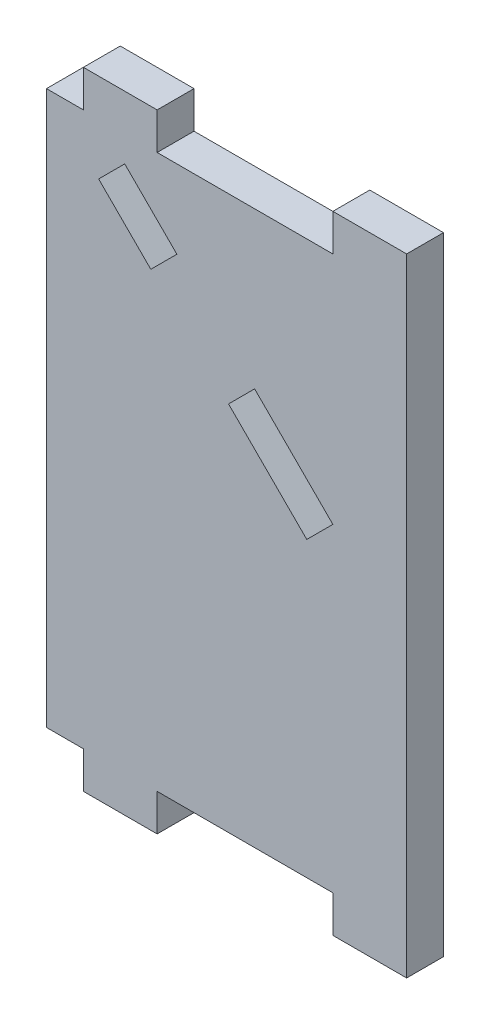
ISO-10303-21;
HEADER;
FILE_DESCRIPTION(('STEP AP214'),'2;1');
FILE_NAME('part.step','',(''),(''),'','','');
FILE_SCHEMA(('AUTOMOTIVE_DESIGN { 1 0 10303 214 1 1 1 1 }'));
ENDSEC;
DATA;
#1=APPLICATION_CONTEXT('core data for automotive mechanical design processes');
#2=APPLICATION_PROTOCOL_DEFINITION('international standard','automotive_design',2000,#1);
#3=PRODUCT_CONTEXT('',#1,'mechanical');
#4=PRODUCT('Part','Part','',(#3));
#5=PRODUCT_RELATED_PRODUCT_CATEGORY('part','',(#4));
#6=PRODUCT_DEFINITION_FORMATION('','',#4);
#7=PRODUCT_DEFINITION_CONTEXT('part definition',#1,'design');
#8=PRODUCT_DEFINITION('design','',#6,#7);
#9=PRODUCT_DEFINITION_SHAPE('','',#8);
#10=(LENGTH_UNIT() NAMED_UNIT(*) SI_UNIT(.MILLI.,.METRE.));
#11=(NAMED_UNIT(*) PLANE_ANGLE_UNIT() SI_UNIT($,.RADIAN.));
#12=(NAMED_UNIT(*) SI_UNIT($,.STERADIAN.) SOLID_ANGLE_UNIT());
#13=UNCERTAINTY_MEASURE_WITH_UNIT(LENGTH_MEASURE(1.E-05),#10,'distance_accuracy_value','');
#14=(GEOMETRIC_REPRESENTATION_CONTEXT(3) GLOBAL_UNCERTAINTY_ASSIGNED_CONTEXT((#13)) GLOBAL_UNIT_ASSIGNED_CONTEXT((#10,
#11,#12)) REPRESENTATION_CONTEXT('',''));
#15=CARTESIAN_POINT('',(0.,0.,0.));
#16=DIRECTION('',(0.,0.,1.));
#17=DIRECTION('',(1.,0.,0.));
#18=AXIS2_PLACEMENT_3D('',#15,#16,#17);
#19=CARTESIAN_POINT('',(0.,75.,5.));
#20=DIRECTION('',(0.,-1.,0.));
#21=DIRECTION('',(0.,0.,-1.));
#22=AXIS2_PLACEMENT_3D('',#19,#20,#21);
#23=PLANE('',#22);
#24=DIRECTION('',(-1.,0.,0.));
#25=VECTOR('',#24,1.);
#26=CARTESIAN_POINT('',(0.,75.,0.));
#27=LINE('',#26,#25);
#28=CARTESIAN_POINT('',(-43.8201622871417,75.,0.));
#29=VERTEX_POINT('',#28);
#30=CARTESIAN_POINT('',(-48.8201622871417,75.,0.));
#31=VERTEX_POINT('',#30);
#32=EDGE_CURVE('E250',#29,#31,#27,.T.);
#33=ORIENTED_EDGE('',*,*,#32,.T.);
#34=DIRECTION('',(0.,0.,-1.));
#35=VECTOR('',#34,1.);
#36=CARTESIAN_POINT('',(-48.8201622871417,75.,5.));
#37=LINE('',#36,#35);
#38=CARTESIAN_POINT('',(-48.8201622871417,75.,5.));
#39=VERTEX_POINT('',#38);
#40=EDGE_CURVE('E11',#39,#31,#37,.T.);
#41=ORIENTED_EDGE('',*,*,#40,.F.);
#42=DIRECTION('',(-1.,0.,0.));
#43=VECTOR('',#42,1.);
#44=CARTESIAN_POINT('',(0.,75.,5.));
#45=LINE('',#44,#43);
#46=CARTESIAN_POINT('',(-43.8201622871417,75.,5.));
#47=VERTEX_POINT('',#46);
#48=EDGE_CURVE('E369',#47,#39,#45,.T.);
#49=ORIENTED_EDGE('',*,*,#48,.F.);
#50=DIRECTION('',(0.,0.,-1.));
#51=VECTOR('',#50,1.);
#52=CARTESIAN_POINT('',(-43.8201622871417,75.,5.));
#53=LINE('',#52,#51);
#54=EDGE_CURVE('E52',#47,#29,#53,.T.);
#55=ORIENTED_EDGE('',*,*,#54,.T.);
#56=EDGE_LOOP('',(#33,#41,#49,#55));
#57=FACE_BOUND('',#56,.T.);
#58=ADVANCED_FACE('F33',(#57),#23,.F.);
#59=CARTESIAN_POINT('',(-48.8201622871417,0.,5.));
#60=DIRECTION('',(-1.,0.,0.));
#61=DIRECTION('',(0.,0.,1.));
#62=AXIS2_PLACEMENT_3D('',#59,#60,#61);
#63=PLANE('',#62);
#64=DIRECTION('',(0.,1.,0.));
#65=VECTOR('',#64,1.);
#66=CARTESIAN_POINT('',(-48.8201622871417,0.,0.));
#67=LINE('',#66,#65);
#68=CARTESIAN_POINT('',(-48.8201622871417,0.,0.));
#69=VERTEX_POINT('',#68);
#70=EDGE_CURVE('E252',#69,#31,#67,.T.);
#71=ORIENTED_EDGE('',*,*,#70,.F.);
#72=DIRECTION('',(0.,0.,-1.));
#73=VECTOR('',#72,1.);
#74=CARTESIAN_POINT('',(-48.8201622871417,0.,5.));
#75=LINE('',#74,#73);
#76=CARTESIAN_POINT('',(-48.8201622871417,0.,5.));
#77=VERTEX_POINT('',#76);
#78=EDGE_CURVE('E43',#77,#69,#75,.T.);
#79=ORIENTED_EDGE('',*,*,#78,.F.);
#80=DIRECTION('',(0.,1.,0.));
#81=VECTOR('',#80,1.);
#82=CARTESIAN_POINT('',(-48.8201622871417,0.,5.));
#83=LINE('',#82,#81);
#84=EDGE_CURVE('E371',#77,#39,#83,.T.);
#85=ORIENTED_EDGE('',*,*,#84,.T.);
#86=ORIENTED_EDGE('',*,*,#40,.T.);
#87=EDGE_LOOP('',(#71,#79,#85,#86));
#88=FACE_BOUND('',#87,.T.);
#89=ADVANCED_FACE('F423',(#88),#63,.T.);
#90=CARTESIAN_POINT('',(0.,0.,5.));
#91=DIRECTION('',(0.,-1.,0.));
#92=DIRECTION('',(1.,0.,0.));
#93=AXIS2_PLACEMENT_3D('',#90,#91,#92);
#94=PLANE('',#93);
#95=DIRECTION('',(-1.,0.,0.));
#96=VECTOR('',#95,1.);
#97=CARTESIAN_POINT('',(0.,0.,0.));
#98=LINE('',#97,#96);
#99=CARTESIAN_POINT('',(-43.8201622871417,0.,0.));
#100=VERTEX_POINT('',#99);
#101=EDGE_CURVE('E255',#100,#69,#98,.T.);
#102=ORIENTED_EDGE('',*,*,#101,.F.);
#103=DIRECTION('',(0.,0.,-1.));
#104=VECTOR('',#103,1.);
#105=CARTESIAN_POINT('',(-43.8201622871417,0.,5.));
#106=LINE('',#105,#104);
#107=CARTESIAN_POINT('',(-43.8201622871417,0.,5.));
#108=VERTEX_POINT('',#107);
#109=EDGE_CURVE('E316',#108,#100,#106,.T.);
#110=ORIENTED_EDGE('',*,*,#109,.F.);
#111=DIRECTION('',(-1.,0.,0.));
#112=VECTOR('',#111,1.);
#113=CARTESIAN_POINT('',(0.,0.,5.));
#114=LINE('',#113,#112);
#115=EDGE_CURVE('E374',#108,#77,#114,.T.);
#116=ORIENTED_EDGE('',*,*,#115,.T.);
#117=ORIENTED_EDGE('',*,*,#78,.T.);
#118=EDGE_LOOP('',(#102,#110,#116,#117));
#119=FACE_BOUND('',#118,.T.);
#120=ADVANCED_FACE('F428',(#119),#94,.T.);
#121=CARTESIAN_POINT('',(-43.8201622871417,0.,5.));
#122=DIRECTION('',(1.,0.,0.));
#123=DIRECTION('',(0.,0.,-1.));
#124=AXIS2_PLACEMENT_3D('',#121,#122,#123);
#125=PLANE('',#124);
#126=DIRECTION('',(0.,-1.,0.));
#127=VECTOR('',#126,1.);
#128=CARTESIAN_POINT('',(-43.8201622871417,0.,0.));
#129=LINE('',#128,#127);
#130=CARTESIAN_POINT('',(-43.8201622871417,-5.00000000000002,0.));
#131=VERTEX_POINT('',#130);
#132=EDGE_CURVE('E258',#100,#131,#129,.T.);
#133=ORIENTED_EDGE('',*,*,#132,.T.);
#134=DIRECTION('',(0.,0.,-1.));
#135=VECTOR('',#134,1.);
#136=CARTESIAN_POINT('',(-43.8201622871417,-5.00000000000002,5.));
#137=LINE('',#136,#135);
#138=CARTESIAN_POINT('',(-43.8201622871417,-5.00000000000002,5.));
#139=VERTEX_POINT('',#138);
#140=EDGE_CURVE('E313',#139,#131,#137,.T.);
#141=ORIENTED_EDGE('',*,*,#140,.F.);
#142=DIRECTION('',(0.,-1.,0.));
#143=VECTOR('',#142,1.);
#144=CARTESIAN_POINT('',(-43.8201622871417,0.,5.));
#145=LINE('',#144,#143);
#146=EDGE_CURVE('E377',#108,#139,#145,.T.);
#147=ORIENTED_EDGE('',*,*,#146,.F.);
#148=ORIENTED_EDGE('',*,*,#109,.T.);
#149=EDGE_LOOP('',(#133,#141,#147,#148));
#150=FACE_BOUND('',#149,.T.);
#151=ADVANCED_FACE('F562',(#150),#125,.F.);
#152=CARTESIAN_POINT('',(0.,-5.00000000000002,5.));
#153=DIRECTION('',(0.,1.,0.));
#154=DIRECTION('',(0.,0.,1.));
#155=AXIS2_PLACEMENT_3D('',#152,#153,#154);
#156=PLANE('',#155);
#157=DIRECTION('',(1.,0.,0.));
#158=VECTOR('',#157,1.);
#159=CARTESIAN_POINT('',(0.,-5.00000000000002,0.));
#160=LINE('',#159,#158);
#161=CARTESIAN_POINT('',(-33.8201622871417,-5.00000000000002,0.));
#162=VERTEX_POINT('',#161);
#163=EDGE_CURVE('E260',#131,#162,#160,.T.);
#164=ORIENTED_EDGE('',*,*,#163,.T.);
#165=DIRECTION('',(0.,0.,-1.));
#166=VECTOR('',#165,1.);
#167=CARTESIAN_POINT('',(-33.8201622871417,-5.00000000000002,5.));
#168=LINE('',#167,#166);
#169=CARTESIAN_POINT('',(-33.8201622871417,-5.00000000000002,5.));
#170=VERTEX_POINT('',#169);
#171=EDGE_CURVE('E311',#170,#162,#168,.T.);
#172=ORIENTED_EDGE('',*,*,#171,.F.);
#173=DIRECTION('',(1.,0.,0.));
#174=VECTOR('',#173,1.);
#175=CARTESIAN_POINT('',(0.,-5.00000000000002,5.));
#176=LINE('',#175,#174);
#177=EDGE_CURVE('E379',#139,#170,#176,.T.);
#178=ORIENTED_EDGE('',*,*,#177,.F.);
#179=ORIENTED_EDGE('',*,*,#140,.T.);
#180=EDGE_LOOP('',(#164,#172,#178,#179));
#181=FACE_BOUND('',#180,.T.);
#182=ADVANCED_FACE('F552',(#181),#156,.F.);
#183=CARTESIAN_POINT('',(-33.8201622871417,0.,5.));
#184=DIRECTION('',(1.,0.,0.));
#185=DIRECTION('',(0.,0.,-1.));
#186=AXIS2_PLACEMENT_3D('',#183,#184,#185);
#187=PLANE('',#186);
#188=DIRECTION('',(0.,-1.,0.));
#189=VECTOR('',#188,1.);
#190=CARTESIAN_POINT('',(-33.8201622871417,0.,0.));
#191=LINE('',#190,#189);
#192=CARTESIAN_POINT('',(-33.8201622871417,0.,0.));
#193=VERTEX_POINT('',#192);
#194=EDGE_CURVE('E263',#193,#162,#191,.T.);
#195=ORIENTED_EDGE('',*,*,#194,.F.);
#196=DIRECTION('',(0.,0.,-1.));
#197=VECTOR('',#196,1.);
#198=CARTESIAN_POINT('',(-33.8201622871417,0.,5.));
#199=LINE('',#198,#197);
#200=CARTESIAN_POINT('',(-33.8201622871417,0.,5.));
#201=VERTEX_POINT('',#200);
#202=EDGE_CURVE('E309',#201,#193,#199,.T.);
#203=ORIENTED_EDGE('',*,*,#202,.F.);
#204=DIRECTION('',(0.,-1.,0.));
#205=VECTOR('',#204,1.);
#206=CARTESIAN_POINT('',(-33.8201622871417,0.,5.));
#207=LINE('',#206,#205);
#208=EDGE_CURVE('E381',#201,#170,#207,.T.);
#209=ORIENTED_EDGE('',*,*,#208,.T.);
#210=ORIENTED_EDGE('',*,*,#171,.T.);
#211=EDGE_LOOP('',(#195,#203,#209,#210));
#212=FACE_BOUND('',#211,.T.);
#213=ADVANCED_FACE('F542',(#212),#187,.T.);
#214=CARTESIAN_POINT('',(0.,0.,5.));
#215=DIRECTION('',(0.,-1.,0.));
#216=DIRECTION('',(1.,0.,0.));
#217=AXIS2_PLACEMENT_3D('',#214,#215,#216);
#218=PLANE('',#217);
#219=DIRECTION('',(-1.,0.,0.));
#220=VECTOR('',#219,1.);
#221=CARTESIAN_POINT('',(0.,0.,0.));
#222=LINE('',#221,#220);
#223=CARTESIAN_POINT('',(-10.,0.,0.));
#224=VERTEX_POINT('',#223);
#225=EDGE_CURVE('E266',#224,#193,#222,.T.);
#226=ORIENTED_EDGE('',*,*,#225,.F.);
#227=DIRECTION('',(0.,0.,-1.));
#228=VECTOR('',#227,1.);
#229=CARTESIAN_POINT('',(-10.,0.,5.));
#230=LINE('',#229,#228);
#231=CARTESIAN_POINT('',(-10.,0.,5.));
#232=VERTEX_POINT('',#231);
#233=EDGE_CURVE('E307',#232,#224,#230,.T.);
#234=ORIENTED_EDGE('',*,*,#233,.F.);
#235=DIRECTION('',(-1.,0.,0.));
#236=VECTOR('',#235,1.);
#237=CARTESIAN_POINT('',(0.,0.,5.));
#238=LINE('',#237,#236);
#239=EDGE_CURVE('E384',#232,#201,#238,.T.);
#240=ORIENTED_EDGE('',*,*,#239,.T.);
#241=ORIENTED_EDGE('',*,*,#202,.T.);
#242=EDGE_LOOP('',(#226,#234,#240,#241));
#243=FACE_BOUND('',#242,.T.);
#244=ADVANCED_FACE('F532',(#243),#218,.T.);
#245=CARTESIAN_POINT('',(-10.,0.,5.));
#246=DIRECTION('',(1.,0.,0.));
#247=DIRECTION('',(0.,0.,-1.));
#248=AXIS2_PLACEMENT_3D('',#245,#246,#247);
#249=PLANE('',#248);
#250=DIRECTION('',(0.,-1.,0.));
#251=VECTOR('',#250,1.);
#252=CARTESIAN_POINT('',(-10.,0.,0.));
#253=LINE('',#252,#251);
#254=CARTESIAN_POINT('',(-10.,-5.00000000000001,0.));
#255=VERTEX_POINT('',#254);
#256=EDGE_CURVE('E269',#224,#255,#253,.T.);
#257=ORIENTED_EDGE('',*,*,#256,.T.);
#258=DIRECTION('',(0.,0.,-1.));
#259=VECTOR('',#258,1.);
#260=CARTESIAN_POINT('',(-10.,-5.00000000000001,5.));
#261=LINE('',#260,#259);
#262=CARTESIAN_POINT('',(-10.,-5.00000000000001,5.));
#263=VERTEX_POINT('',#262);
#264=EDGE_CURVE('E305',#263,#255,#261,.T.);
#265=ORIENTED_EDGE('',*,*,#264,.F.);
#266=DIRECTION('',(0.,-1.,0.));
#267=VECTOR('',#266,1.);
#268=CARTESIAN_POINT('',(-10.,0.,5.));
#269=LINE('',#268,#267);
#270=EDGE_CURVE('E387',#232,#263,#269,.T.);
#271=ORIENTED_EDGE('',*,*,#270,.F.);
#272=ORIENTED_EDGE('',*,*,#233,.T.);
#273=EDGE_LOOP('',(#257,#265,#271,#272));
#274=FACE_BOUND('',#273,.T.);
#275=ADVANCED_FACE('F521',(#274),#249,.F.);
#276=CARTESIAN_POINT('',(0.,-5.00000000000001,5.));
#277=DIRECTION('',(0.,-1.,0.));
#278=DIRECTION('',(1.,0.,0.));
#279=AXIS2_PLACEMENT_3D('',#276,#277,#278);
#280=PLANE('',#279);
#281=DIRECTION('',(-1.,0.,0.));
#282=VECTOR('',#281,1.);
#283=CARTESIAN_POINT('',(0.,-5.00000000000001,0.));
#284=LINE('',#283,#282);
#285=CARTESIAN_POINT('',(0.,-5.00000000000001,0.));
#286=VERTEX_POINT('',#285);
#287=EDGE_CURVE('E272',#286,#255,#284,.T.);
#288=ORIENTED_EDGE('',*,*,#287,.F.);
#289=DIRECTION('',(0.,0.,-1.));
#290=VECTOR('',#289,1.);
#291=CARTESIAN_POINT('',(0.,-5.00000000000001,5.));
#292=LINE('',#291,#290);
#293=CARTESIAN_POINT('',(0.,-5.00000000000001,5.));
#294=VERTEX_POINT('',#293);
#295=EDGE_CURVE('E303',#294,#286,#292,.T.);
#296=ORIENTED_EDGE('',*,*,#295,.F.);
#297=DIRECTION('',(-1.,0.,0.));
#298=VECTOR('',#297,1.);
#299=CARTESIAN_POINT('',(0.,-5.00000000000001,5.));
#300=LINE('',#299,#298);
#301=EDGE_CURVE('E389',#294,#263,#300,.T.);
#302=ORIENTED_EDGE('',*,*,#301,.T.);
#303=ORIENTED_EDGE('',*,*,#264,.T.);
#304=EDGE_LOOP('',(#288,#296,#302,#303));
#305=FACE_BOUND('',#304,.T.);
#306=ADVANCED_FACE('F510',(#305),#280,.T.);
#307=CARTESIAN_POINT('',(0.,0.,5.));
#308=DIRECTION('',(1.,0.,0.));
#309=DIRECTION('',(0.,1.,0.));
#310=AXIS2_PLACEMENT_3D('',#307,#308,#309);
#311=PLANE('',#310);
#312=DIRECTION('',(0.,-1.,0.));
#313=VECTOR('',#312,1.);
#314=CARTESIAN_POINT('',(0.,0.,0.));
#315=LINE('',#314,#313);
#316=CARTESIAN_POINT('',(0.,80.0000000000002,0.));
#317=VERTEX_POINT('',#316);
#318=EDGE_CURVE('E275',#317,#286,#315,.T.);
#319=ORIENTED_EDGE('',*,*,#318,.F.);
#320=DIRECTION('',(0.,0.,-1.));
#321=VECTOR('',#320,1.);
#322=CARTESIAN_POINT('',(0.,80.0000000000002,5.));
#323=LINE('',#322,#321);
#324=CARTESIAN_POINT('',(0.,80.0000000000002,5.));
#325=VERTEX_POINT('',#324);
#326=EDGE_CURVE('E301',#325,#317,#323,.T.);
#327=ORIENTED_EDGE('',*,*,#326,.F.);
#328=DIRECTION('',(0.,-1.,0.));
#329=VECTOR('',#328,1.);
#330=CARTESIAN_POINT('',(0.,0.,5.));
#331=LINE('',#330,#329);
#332=EDGE_CURVE('E392',#325,#294,#331,.T.);
#333=ORIENTED_EDGE('',*,*,#332,.T.);
#334=ORIENTED_EDGE('',*,*,#295,.T.);
#335=EDGE_LOOP('',(#319,#327,#333,#334));
#336=FACE_BOUND('',#335,.T.);
#337=ADVANCED_FACE('F501',(#336),#311,.T.);
#338=CARTESIAN_POINT('',(0.,80.0000000000002,5.));
#339=DIRECTION('',(0.,-1.,0.));
#340=DIRECTION('',(0.,0.,-1.));
#341=AXIS2_PLACEMENT_3D('',#338,#339,#340);
#342=PLANE('',#341);
#343=DIRECTION('',(-1.,0.,0.));
#344=VECTOR('',#343,1.);
#345=CARTESIAN_POINT('',(0.,80.0000000000002,0.));
#346=LINE('',#345,#344);
#347=CARTESIAN_POINT('',(-10.,80.0000000000002,0.));
#348=VERTEX_POINT('',#347);
#349=EDGE_CURVE('E278',#317,#348,#346,.T.);
#350=ORIENTED_EDGE('',*,*,#349,.T.);
#351=DIRECTION('',(0.,0.,-1.));
#352=VECTOR('',#351,1.);
#353=CARTESIAN_POINT('',(-10.,80.0000000000002,5.));
#354=LINE('',#353,#352);
#355=CARTESIAN_POINT('',(-10.,80.0000000000002,5.));
#356=VERTEX_POINT('',#355);
#357=EDGE_CURVE('E299',#356,#348,#354,.T.);
#358=ORIENTED_EDGE('',*,*,#357,.F.);
#359=DIRECTION('',(-1.,0.,0.));
#360=VECTOR('',#359,1.);
#361=CARTESIAN_POINT('',(0.,80.0000000000002,5.));
#362=LINE('',#361,#360);
#363=EDGE_CURVE('E395',#325,#356,#362,.T.);
#364=ORIENTED_EDGE('',*,*,#363,.F.);
#365=ORIENTED_EDGE('',*,*,#326,.T.);
#366=EDGE_LOOP('',(#350,#358,#364,#365));
#367=FACE_BOUND('',#366,.T.);
#368=ADVANCED_FACE('F407',(#367),#342,.F.);
#369=CARTESIAN_POINT('',(-10.,0.,5.));
#370=DIRECTION('',(-1.,0.,0.));
#371=DIRECTION('',(0.,0.,1.));
#372=AXIS2_PLACEMENT_3D('',#369,#370,#371);
#373=PLANE('',#372);
#374=DIRECTION('',(0.,1.,0.));
#375=VECTOR('',#374,1.);
#376=CARTESIAN_POINT('',(-10.,0.,0.));
#377=LINE('',#376,#375);
#378=CARTESIAN_POINT('',(-10.,75.,0.));
#379=VERTEX_POINT('',#378);
#380=EDGE_CURVE('E281',#379,#348,#377,.T.);
#381=ORIENTED_EDGE('',*,*,#380,.F.);
#382=DIRECTION('',(0.,0.,-1.));
#383=VECTOR('',#382,1.);
#384=CARTESIAN_POINT('',(-10.,75.,5.));
#385=LINE('',#384,#383);
#386=CARTESIAN_POINT('',(-10.,75.,5.));
#387=VERTEX_POINT('',#386);
#388=EDGE_CURVE('E297',#387,#379,#385,.T.);
#389=ORIENTED_EDGE('',*,*,#388,.F.);
#390=DIRECTION('',(0.,1.,0.));
#391=VECTOR('',#390,1.);
#392=CARTESIAN_POINT('',(-10.,0.,5.));
#393=LINE('',#392,#391);
#394=EDGE_CURVE('E397',#387,#356,#393,.T.);
#395=ORIENTED_EDGE('',*,*,#394,.T.);
#396=ORIENTED_EDGE('',*,*,#357,.T.);
#397=EDGE_LOOP('',(#381,#389,#395,#396));
#398=FACE_BOUND('',#397,.T.);
#399=ADVANCED_FACE('F401',(#398),#373,.T.);
#400=CARTESIAN_POINT('',(0.,75.,5.));
#401=DIRECTION('',(0.,-1.,0.));
#402=DIRECTION('',(0.,0.,-1.));
#403=AXIS2_PLACEMENT_3D('',#400,#401,#402);
#404=PLANE('',#403);
#405=DIRECTION('',(-1.,0.,0.));
#406=VECTOR('',#405,1.);
#407=CARTESIAN_POINT('',(0.,75.,0.));
#408=LINE('',#407,#406);
#409=CARTESIAN_POINT('',(-33.8201622871417,75.,0.));
#410=VERTEX_POINT('',#409);
#411=EDGE_CURVE('E284',#379,#410,#408,.T.);
#412=ORIENTED_EDGE('',*,*,#411,.T.);
#413=DIRECTION('',(0.,0.,-1.));
#414=VECTOR('',#413,1.);
#415=CARTESIAN_POINT('',(-33.8201622871417,75.,5.));
#416=LINE('',#415,#414);
#417=CARTESIAN_POINT('',(-33.8201622871417,75.,5.));
#418=VERTEX_POINT('',#417);
#419=EDGE_CURVE('E221',#418,#410,#416,.T.);
#420=ORIENTED_EDGE('',*,*,#419,.F.);
#421=DIRECTION('',(-1.,0.,0.));
#422=VECTOR('',#421,1.);
#423=CARTESIAN_POINT('',(0.,75.,5.));
#424=LINE('',#423,#422);
#425=EDGE_CURVE('E209',#387,#418,#424,.T.);
#426=ORIENTED_EDGE('',*,*,#425,.F.);
#427=ORIENTED_EDGE('',*,*,#388,.T.);
#428=EDGE_LOOP('',(#412,#420,#426,#427));
#429=FACE_BOUND('',#428,.T.);
#430=ADVANCED_FACE('F413',(#429),#404,.F.);
#431=CARTESIAN_POINT('',(-33.8201622871417,0.,5.));
#432=DIRECTION('',(-1.,0.,0.));
#433=DIRECTION('',(0.,0.,1.));
#434=AXIS2_PLACEMENT_3D('',#431,#432,#433);
#435=PLANE('',#434);
#436=DIRECTION('',(0.,1.,0.));
#437=VECTOR('',#436,1.);
#438=CARTESIAN_POINT('',(-33.8201622871417,0.,0.));
#439=LINE('',#438,#437);
#440=CARTESIAN_POINT('',(-33.8201622871417,80.0000000000002,0.));
#441=VERTEX_POINT('',#440);
#442=EDGE_CURVE('E218',#410,#441,#439,.T.);
#443=ORIENTED_EDGE('',*,*,#442,.T.);
#444=DIRECTION('',(0.,0.,-1.));
#445=VECTOR('',#444,1.);
#446=CARTESIAN_POINT('',(-33.8201622871417,80.0000000000002,5.));
#447=LINE('',#446,#445);
#448=CARTESIAN_POINT('',(-33.8201622871417,80.0000000000002,5.));
#449=VERTEX_POINT('',#448);
#450=EDGE_CURVE('E215',#449,#441,#447,.T.);
#451=ORIENTED_EDGE('',*,*,#450,.F.);
#452=DIRECTION('',(0.,1.,0.));
#453=VECTOR('',#452,1.);
#454=CARTESIAN_POINT('',(-33.8201622871417,0.,5.));
#455=LINE('',#454,#453);
#456=EDGE_CURVE('E201',#418,#449,#455,.T.);
#457=ORIENTED_EDGE('',*,*,#456,.F.);
#458=ORIENTED_EDGE('',*,*,#419,.T.);
#459=EDGE_LOOP('',(#443,#451,#457,#458));
#460=FACE_BOUND('',#459,.T.);
#461=ADVANCED_FACE('F216',(#460),#435,.F.);
#462=CARTESIAN_POINT('',(0.,80.0000000000002,5.));
#463=DIRECTION('',(0.,1.,0.));
#464=DIRECTION('',(0.,0.,1.));
#465=AXIS2_PLACEMENT_3D('',#462,#463,#464);
#466=PLANE('',#465);
#467=DIRECTION('',(1.,0.,0.));
#468=VECTOR('',#467,1.);
#469=CARTESIAN_POINT('',(0.,80.0000000000002,0.));
#470=LINE('',#469,#468);
#471=CARTESIAN_POINT('',(-43.8201622871417,80.0000000000002,0.));
#472=VERTEX_POINT('',#471);
#473=EDGE_CURVE('E287',#472,#441,#470,.T.);
#474=ORIENTED_EDGE('',*,*,#473,.F.);
#475=DIRECTION('',(0.,0.,-1.));
#476=VECTOR('',#475,1.);
#477=CARTESIAN_POINT('',(-43.8201622871417,80.0000000000002,5.));
#478=LINE('',#477,#476);
#479=CARTESIAN_POINT('',(-43.8201622871417,80.0000000000002,5.));
#480=VERTEX_POINT('',#479);
#481=EDGE_CURVE('E125',#480,#472,#478,.T.);
#482=ORIENTED_EDGE('',*,*,#481,.F.);
#483=DIRECTION('',(1.,0.,0.));
#484=VECTOR('',#483,1.);
#485=CARTESIAN_POINT('',(0.,80.0000000000002,5.));
#486=LINE('',#485,#484);
#487=EDGE_CURVE('E206',#480,#449,#486,.T.);
#488=ORIENTED_EDGE('',*,*,#487,.T.);
#489=ORIENTED_EDGE('',*,*,#450,.T.);
#490=EDGE_LOOP('',(#474,#482,#488,#489));
#491=FACE_BOUND('',#490,.T.);
#492=ADVANCED_FACE('F223',(#491),#466,.T.);
#493=CARTESIAN_POINT('',(13.0899188564294,13.0899188564296,5.));
#494=DIRECTION('',(0.707106781186544,0.707106781186551,0.));
#495=DIRECTION('',(-0.707106781186551,0.707106781186544,0.));
#496=AXIS2_PLACEMENT_3D('',#493,#494,#495);
#497=PLANE('',#496);
#498=DIRECTION('',(0.707106781186551,-0.707106781186544,0.));
#499=VECTOR('',#498,1.);
#500=CARTESIAN_POINT('',(13.0899188564294,13.0899188564296,0.));
#501=LINE('',#500,#499);
#502=CARTESIAN_POINT('',(-24.142135623731,50.3219733365896,0.));
#503=VERTEX_POINT('',#502);
#504=CARTESIAN_POINT('',(-13.5355339059327,39.7153716187915,0.));
#505=VERTEX_POINT('',#504);
#506=EDGE_CURVE('E234',#503,#505,#501,.T.);
#507=ORIENTED_EDGE('',*,*,#506,.F.);
#508=DIRECTION('',(0.,0.,-1.));
#509=VECTOR('',#508,1.);
#510=CARTESIAN_POINT('',(-24.142135623731,50.3219733365896,5.));
#511=LINE('',#510,#509);
#512=CARTESIAN_POINT('',(-24.142135623731,50.3219733365896,5.));
#513=VERTEX_POINT('',#512);
#514=EDGE_CURVE('E294',#513,#503,#511,.T.);
#515=ORIENTED_EDGE('',*,*,#514,.F.);
#516=DIRECTION('',(0.707106781186551,-0.707106781186544,0.));
#517=VECTOR('',#516,1.);
#518=CARTESIAN_POINT('',(13.0899188564294,13.0899188564296,5.));
#519=LINE('',#518,#517);
#520=CARTESIAN_POINT('',(-13.5355339059327,39.7153716187915,5.));
#521=VERTEX_POINT('',#520);
#522=EDGE_CURVE('E356',#513,#521,#519,.T.);
#523=ORIENTED_EDGE('',*,*,#522,.T.);
#524=DIRECTION('',(0.,0.,-1.));
#525=VECTOR('',#524,1.);
#526=CARTESIAN_POINT('',(-13.5355339059327,39.7153716187915,5.));
#527=LINE('',#526,#525);
#528=EDGE_CURVE('E319',#521,#505,#527,.T.);
#529=ORIENTED_EDGE('',*,*,#528,.T.);
#530=EDGE_LOOP('',(#507,#515,#523,#529));
#531=FACE_BOUND('',#530,.T.);
#532=ADVANCED_FACE('F444',(#531),#497,.T.);
#533=CARTESIAN_POINT('',(-37.2320544801604,37.23205448016,5.));
#534=DIRECTION('',(-0.707106781186552,0.707106781186543,0.));
#535=DIRECTION('',(-0.707106781186543,-0.707106781186552,0.));
#536=AXIS2_PLACEMENT_3D('',#533,#534,#535);
#537=PLANE('',#536);
#538=DIRECTION('',(0.707106781186543,0.707106781186552,0.));
#539=VECTOR('',#538,1.);
#540=CARTESIAN_POINT('',(-37.2320544801604,37.23205448016,0.));
#541=LINE('',#540,#539);
#542=CARTESIAN_POINT('',(-20.6066017177983,53.8575072425224,0.));
#543=VERTEX_POINT('',#542);
#544=EDGE_CURVE('E241',#503,#543,#541,.T.);
#545=ORIENTED_EDGE('',*,*,#544,.T.);
#546=DIRECTION('',(0.,0.,-1.));
#547=VECTOR('',#546,1.);
#548=CARTESIAN_POINT('',(-20.6066017177983,53.8575072425224,5.));
#549=LINE('',#548,#547);
#550=CARTESIAN_POINT('',(-20.6066017177983,53.8575072425224,5.));
#551=VERTEX_POINT('',#550);
#552=EDGE_CURVE('E324',#551,#543,#549,.T.);
#553=ORIENTED_EDGE('',*,*,#552,.F.);
#554=DIRECTION('',(0.707106781186543,0.707106781186552,0.));
#555=VECTOR('',#554,1.);
#556=CARTESIAN_POINT('',(-37.2320544801604,37.23205448016,5.));
#557=LINE('',#556,#555);
#558=EDGE_CURVE('E361',#513,#551,#557,.T.);
#559=ORIENTED_EDGE('',*,*,#558,.F.);
#560=ORIENTED_EDGE('',*,*,#514,.T.);
#561=EDGE_LOOP('',(#545,#553,#559,#560));
#562=FACE_BOUND('',#561,.T.);
#563=ADVANCED_FACE('F440',(#562),#537,.F.);
#564=CARTESIAN_POINT('',(16.6254527623622,16.6254527623624,5.));
#565=DIRECTION('',(0.707106781186543,0.707106781186552,0.));
#566=DIRECTION('',(-0.707106781186552,0.707106781186543,0.));
#567=AXIS2_PLACEMENT_3D('',#564,#565,#566);
#568=PLANE('',#567);
#569=DIRECTION('',(0.707106781186552,-0.707106781186543,0.));
#570=VECTOR('',#569,1.);
#571=CARTESIAN_POINT('',(16.6254527623622,16.6254527623624,0.));
#572=LINE('',#571,#570);
#573=CARTESIAN_POINT('',(-10.,43.2509055247242,0.));
#574=VERTEX_POINT('',#573);
#575=EDGE_CURVE('E244',#543,#574,#572,.T.);
#576=ORIENTED_EDGE('',*,*,#575,.T.);
#577=DIRECTION('',(0.,0.,-1.));
#578=VECTOR('',#577,1.);
#579=CARTESIAN_POINT('',(-10.,43.2509055247242,5.));
#580=LINE('',#579,#578);
#581=CARTESIAN_POINT('',(-10.,43.2509055247242,5.));
#582=VERTEX_POINT('',#581);
#583=EDGE_CURVE('E321',#582,#574,#580,.T.);
#584=ORIENTED_EDGE('',*,*,#583,.F.);
#585=DIRECTION('',(0.707106781186552,-0.707106781186543,0.));
#586=VECTOR('',#585,1.);
#587=CARTESIAN_POINT('',(16.6254527623622,16.6254527623624,5.));
#588=LINE('',#587,#586);
#589=EDGE_CURVE('E364',#551,#582,#588,.T.);
#590=ORIENTED_EDGE('',*,*,#589,.F.);
#591=ORIENTED_EDGE('',*,*,#552,.T.);
#592=EDGE_LOOP('',(#576,#584,#590,#591));
#593=FACE_BOUND('',#592,.T.);
#594=ADVANCED_FACE('F437',(#593),#568,.F.);
#595=CARTESIAN_POINT('',(-41.7490944752761,67.9289321881346,0.));
#596=VERTEX_POINT('',#595);
#597=CARTESIAN_POINT('',(-34.6780266634106,60.8578643762691,0.));
#598=VERTEX_POINT('',#597);
#599=EDGE_CURVE('E230',#596,#598,#501,.T.);
#600=ORIENTED_EDGE('',*,*,#599,.F.);
#601=DIRECTION('',(0.,0.,-1.));
#602=VECTOR('',#601,1.);
#603=CARTESIAN_POINT('',(-41.7490944752761,67.9289321881346,5.));
#604=LINE('',#603,#602);
#605=CARTESIAN_POINT('',(-41.7490944752761,67.9289321881346,5.));
#606=VERTEX_POINT('',#605);
#607=EDGE_CURVE('E37',#606,#596,#604,.T.);
#608=ORIENTED_EDGE('',*,*,#607,.F.);
#609=CARTESIAN_POINT('',(-34.6780266634106,60.8578643762691,5.));
#610=VERTEX_POINT('',#609);
#611=EDGE_CURVE('E292',#606,#610,#519,.T.);
#612=ORIENTED_EDGE('',*,*,#611,.T.);
#613=DIRECTION('',(0.,0.,-1.));
#614=VECTOR('',#613,1.);
#615=CARTESIAN_POINT('',(-34.6780266634106,60.8578643762691,5.));
#616=LINE('',#615,#614);
#617=EDGE_CURVE('E226',#610,#598,#616,.T.);
#618=ORIENTED_EDGE('',*,*,#617,.T.);
#619=EDGE_LOOP('',(#600,#608,#612,#618));
#620=FACE_BOUND('',#619,.T.);
#621=ADVANCED_FACE('F345',(#620),#497,.T.);
#622=CARTESIAN_POINT('',(-54.8390133317056,54.8390133317049,5.));
#623=DIRECTION('',(-0.707106781186552,0.707106781186543,0.));
#624=DIRECTION('',(-0.707106781186543,-0.707106781186552,0.));
#625=AXIS2_PLACEMENT_3D('',#622,#623,#624);
#626=PLANE('',#625);
#627=DIRECTION('',(0.707106781186543,0.707106781186552,0.));
#628=VECTOR('',#627,1.);
#629=CARTESIAN_POINT('',(-54.8390133317056,54.8390133317049,0.));
#630=LINE('',#629,#628);
#631=CARTESIAN_POINT('',(-38.2135605693434,71.4644660940673,0.));
#632=VERTEX_POINT('',#631);
#633=EDGE_CURVE('E233',#596,#632,#630,.T.);
#634=ORIENTED_EDGE('',*,*,#633,.T.);
#635=DIRECTION('',(0.,0.,-1.));
#636=VECTOR('',#635,1.);
#637=CARTESIAN_POINT('',(-38.2135605693434,71.4644660940673,5.));
#638=LINE('',#637,#636);
#639=CARTESIAN_POINT('',(-38.2135605693434,71.4644660940673,5.));
#640=VERTEX_POINT('',#639);
#641=EDGE_CURVE('E331',#640,#632,#638,.T.);
#642=ORIENTED_EDGE('',*,*,#641,.F.);
#643=DIRECTION('',(0.707106781186543,0.707106781186552,0.));
#644=VECTOR('',#643,1.);
#645=CARTESIAN_POINT('',(-54.8390133317056,54.8390133317049,5.));
#646=LINE('',#645,#644);
#647=EDGE_CURVE('E339',#606,#640,#646,.T.);
#648=ORIENTED_EDGE('',*,*,#647,.F.);
#649=ORIENTED_EDGE('',*,*,#607,.T.);
#650=EDGE_LOOP('',(#634,#642,#648,#649));
#651=FACE_BOUND('',#650,.T.);
#652=ADVANCED_FACE('F35',(#651),#626,.F.);
#653=CARTESIAN_POINT('',(16.6254527623622,16.6254527623625,5.));
#654=DIRECTION('',(0.707106781186542,0.707106781186553,0.));
#655=DIRECTION('',(-0.707106781186553,0.707106781186542,0.));
#656=AXIS2_PLACEMENT_3D('',#653,#654,#655);
#657=PLANE('',#656);
#658=DIRECTION('',(0.707106781186553,-0.707106781186542,0.));
#659=VECTOR('',#658,1.);
#660=CARTESIAN_POINT('',(16.6254527623622,16.6254527623625,0.));
#661=LINE('',#660,#659);
#662=CARTESIAN_POINT('',(-31.1424927574779,64.3933982822019,0.));
#663=VERTEX_POINT('',#662);
#664=EDGE_CURVE('E236',#632,#663,#661,.T.);
#665=ORIENTED_EDGE('',*,*,#664,.T.);
#666=DIRECTION('',(0.,0.,-1.));
#667=VECTOR('',#666,1.);
#668=CARTESIAN_POINT('',(-31.1424927574779,64.3933982822019,5.));
#669=LINE('',#668,#667);
#670=CARTESIAN_POINT('',(-31.1424927574779,64.3933982822019,5.));
#671=VERTEX_POINT('',#670);
#672=EDGE_CURVE('E329',#671,#663,#669,.T.);
#673=ORIENTED_EDGE('',*,*,#672,.F.);
#674=DIRECTION('',(0.707106781186553,-0.707106781186542,0.));
#675=VECTOR('',#674,1.);
#676=CARTESIAN_POINT('',(16.6254527623622,16.6254527623625,5.));
#677=LINE('',#676,#675);
#678=EDGE_CURVE('E353',#640,#671,#677,.T.);
#679=ORIENTED_EDGE('',*,*,#678,.F.);
#680=ORIENTED_EDGE('',*,*,#641,.T.);
#681=EDGE_LOOP('',(#665,#673,#679,#680));
#682=FACE_BOUND('',#681,.T.);
#683=ADVANCED_FACE('F352',(#682),#657,.F.);
#684=CARTESIAN_POINT('',(-26.6254527623622,26.6254527623619,5.));
#685=DIRECTION('',(0.707106781186551,-0.707106781186544,0.));
#686=DIRECTION('',(0.707106781186544,0.707106781186551,0.));
#687=AXIS2_PLACEMENT_3D('',#684,#685,#686);
#688=PLANE('',#687);
#689=DIRECTION('',(-0.707106781186544,-0.707106781186551,0.));
#690=VECTOR('',#689,1.);
#691=CARTESIAN_POINT('',(-26.6254527623622,26.6254527623619,0.));
#692=LINE('',#691,#690);
#693=EDGE_CURVE('E247',#574,#505,#692,.T.);
#694=ORIENTED_EDGE('',*,*,#693,.T.);
#695=ORIENTED_EDGE('',*,*,#528,.F.);
#696=DIRECTION('',(-0.707106781186544,-0.707106781186551,0.));
#697=VECTOR('',#696,1.);
#698=CARTESIAN_POINT('',(-26.6254527623622,26.6254527623619,5.));
#699=LINE('',#698,#697);
#700=EDGE_CURVE('E367',#582,#521,#699,.T.);
#701=ORIENTED_EDGE('',*,*,#700,.F.);
#702=ORIENTED_EDGE('',*,*,#583,.T.);
#703=EDGE_LOOP('',(#694,#695,#701,#702));
#704=FACE_BOUND('',#703,.T.);
#705=ADVANCED_FACE('F433',(#704),#688,.F.);
#706=CARTESIAN_POINT('',(-47.7679455198401,47.7679455198395,5.));
#707=DIRECTION('',(0.707106781186552,-0.707106781186543,0.));
#708=DIRECTION('',(0.707106781186543,0.707106781186552,0.));
#709=AXIS2_PLACEMENT_3D('',#706,#707,#708);
#710=PLANE('',#709);
#711=DIRECTION('',(-0.707106781186543,-0.707106781186552,0.));
#712=VECTOR('',#711,1.);
#713=CARTESIAN_POINT('',(-47.7679455198401,47.7679455198395,0.));
#714=LINE('',#713,#712);
#715=EDGE_CURVE('E238',#663,#598,#714,.T.);
#716=ORIENTED_EDGE('',*,*,#715,.T.);
#717=ORIENTED_EDGE('',*,*,#617,.F.);
#718=DIRECTION('',(-0.707106781186543,-0.707106781186552,0.));
#719=VECTOR('',#718,1.);
#720=CARTESIAN_POINT('',(-47.7679455198401,47.7679455198395,5.));
#721=LINE('',#720,#719);
#722=EDGE_CURVE('E351',#671,#610,#721,.T.);
#723=ORIENTED_EDGE('',*,*,#722,.F.);
#724=ORIENTED_EDGE('',*,*,#672,.T.);
#725=EDGE_LOOP('',(#716,#717,#723,#724));
#726=FACE_BOUND('',#725,.T.);
#727=ADVANCED_FACE('F349',(#726),#710,.F.);
#728=CARTESIAN_POINT('',(-43.8201622871417,0.,5.));
#729=DIRECTION('',(-1.,0.,0.));
#730=DIRECTION('',(0.,0.,1.));
#731=AXIS2_PLACEMENT_3D('',#728,#729,#730);
#732=PLANE('',#731);
#733=DIRECTION('',(0.,1.,0.));
#734=VECTOR('',#733,1.);
#735=CARTESIAN_POINT('',(-43.8201622871417,0.,0.));
#736=LINE('',#735,#734);
#737=EDGE_CURVE('E289',#29,#472,#736,.T.);
#738=ORIENTED_EDGE('',*,*,#737,.F.);
#739=ORIENTED_EDGE('',*,*,#54,.F.);
#740=DIRECTION('',(0.,1.,0.));
#741=VECTOR('',#740,1.);
#742=CARTESIAN_POINT('',(-43.8201622871417,0.,5.));
#743=LINE('',#742,#741);
#744=EDGE_CURVE('E224',#47,#480,#743,.T.);
#745=ORIENTED_EDGE('',*,*,#744,.T.);
#746=ORIENTED_EDGE('',*,*,#481,.T.);
#747=EDGE_LOOP('',(#738,#739,#745,#746));
#748=FACE_BOUND('',#747,.T.);
#749=ADVANCED_FACE('F450',(#748),#732,.T.);
#750=CARTESIAN_POINT('',(0.,0.,5.));
#751=DIRECTION('',(0.,0.,1.));
#752=DIRECTION('',(1.,0.,0.));
#753=AXIS2_PLACEMENT_3D('',#750,#751,#752);
#754=PLANE('',#753);
#755=ORIENTED_EDGE('',*,*,#611,.F.);
#756=ORIENTED_EDGE('',*,*,#647,.T.);
#757=ORIENTED_EDGE('',*,*,#678,.T.);
#758=ORIENTED_EDGE('',*,*,#722,.T.);
#759=EDGE_LOOP('',(#755,#756,#757,#758));
#760=FACE_BOUND('',#759,.T.);
#761=ORIENTED_EDGE('',*,*,#522,.F.);
#762=ORIENTED_EDGE('',*,*,#558,.T.);
#763=ORIENTED_EDGE('',*,*,#589,.T.);
#764=ORIENTED_EDGE('',*,*,#700,.T.);
#765=EDGE_LOOP('',(#761,#762,#763,#764));
#766=FACE_BOUND('',#765,.T.);
#767=ORIENTED_EDGE('',*,*,#48,.T.);
#768=ORIENTED_EDGE('',*,*,#84,.F.);
#769=ORIENTED_EDGE('',*,*,#115,.F.);
#770=ORIENTED_EDGE('',*,*,#146,.T.);
#771=ORIENTED_EDGE('',*,*,#177,.T.);
#772=ORIENTED_EDGE('',*,*,#208,.F.);
#773=ORIENTED_EDGE('',*,*,#239,.F.);
#774=ORIENTED_EDGE('',*,*,#270,.T.);
#775=ORIENTED_EDGE('',*,*,#301,.F.);
#776=ORIENTED_EDGE('',*,*,#332,.F.);
#777=ORIENTED_EDGE('',*,*,#363,.T.);
#778=ORIENTED_EDGE('',*,*,#394,.F.);
#779=ORIENTED_EDGE('',*,*,#425,.T.);
#780=ORIENTED_EDGE('',*,*,#456,.T.);
#781=ORIENTED_EDGE('',*,*,#487,.F.);
#782=ORIENTED_EDGE('',*,*,#744,.F.);
#783=EDGE_LOOP('',(#767,#768,#769,#770,#771,#772,#773,#774,#775,#776,#777,#778,#779,#780,#781,#782));
#784=FACE_BOUND('',#783,.T.);
#785=ADVANCED_FACE('F203',(#760,#766,#784),#754,.T.);
#786=CARTESIAN_POINT('',(0.,0.,0.));
#787=DIRECTION('',(0.,0.,1.));
#788=DIRECTION('',(1.,0.,0.));
#789=AXIS2_PLACEMENT_3D('',#786,#787,#788);
#790=PLANE('',#789);
#791=ORIENTED_EDGE('',*,*,#599,.T.);
#792=ORIENTED_EDGE('',*,*,#715,.F.);
#793=ORIENTED_EDGE('',*,*,#664,.F.);
#794=ORIENTED_EDGE('',*,*,#633,.F.);
#795=EDGE_LOOP('',(#791,#792,#793,#794));
#796=FACE_BOUND('',#795,.T.);
#797=ORIENTED_EDGE('',*,*,#506,.T.);
#798=ORIENTED_EDGE('',*,*,#693,.F.);
#799=ORIENTED_EDGE('',*,*,#575,.F.);
#800=ORIENTED_EDGE('',*,*,#544,.F.);
#801=EDGE_LOOP('',(#797,#798,#799,#800));
#802=FACE_BOUND('',#801,.T.);
#803=ORIENTED_EDGE('',*,*,#32,.F.);
#804=ORIENTED_EDGE('',*,*,#737,.T.);
#805=ORIENTED_EDGE('',*,*,#473,.T.);
#806=ORIENTED_EDGE('',*,*,#442,.F.);
#807=ORIENTED_EDGE('',*,*,#411,.F.);
#808=ORIENTED_EDGE('',*,*,#380,.T.);
#809=ORIENTED_EDGE('',*,*,#349,.F.);
#810=ORIENTED_EDGE('',*,*,#318,.T.);
#811=ORIENTED_EDGE('',*,*,#287,.T.);
#812=ORIENTED_EDGE('',*,*,#256,.F.);
#813=ORIENTED_EDGE('',*,*,#225,.T.);
#814=ORIENTED_EDGE('',*,*,#194,.T.);
#815=ORIENTED_EDGE('',*,*,#163,.F.);
#816=ORIENTED_EDGE('',*,*,#132,.F.);
#817=ORIENTED_EDGE('',*,*,#101,.T.);
#818=ORIENTED_EDGE('',*,*,#70,.T.);
#819=EDGE_LOOP('',(#803,#804,#805,#806,#807,#808,#809,#810,#811,#812,#813,#814,#815,#816,#817,#818));
#820=FACE_BOUND('',#819,.T.);
#821=ADVANCED_FACE('F342',(#796,#802,#820),#790,.F.);
#822=CLOSED_SHELL('',(#58,#89,#120,#151,#182,#213,#244,#275,#306,#337,#368,#399,#430,#461,#492,
#532,#563,#594,#621,#652,#683,#705,#727,#749,#785,#821));
#823=MANIFOLD_SOLID_BREP('B2',#822);
#824=ADVANCED_BREP_SHAPE_REPRESENTATION('',(#18,#823),#14);
#825=SHAPE_DEFINITION_REPRESENTATION(#9,#824);
ENDSEC;
END-ISO-10303-21;
